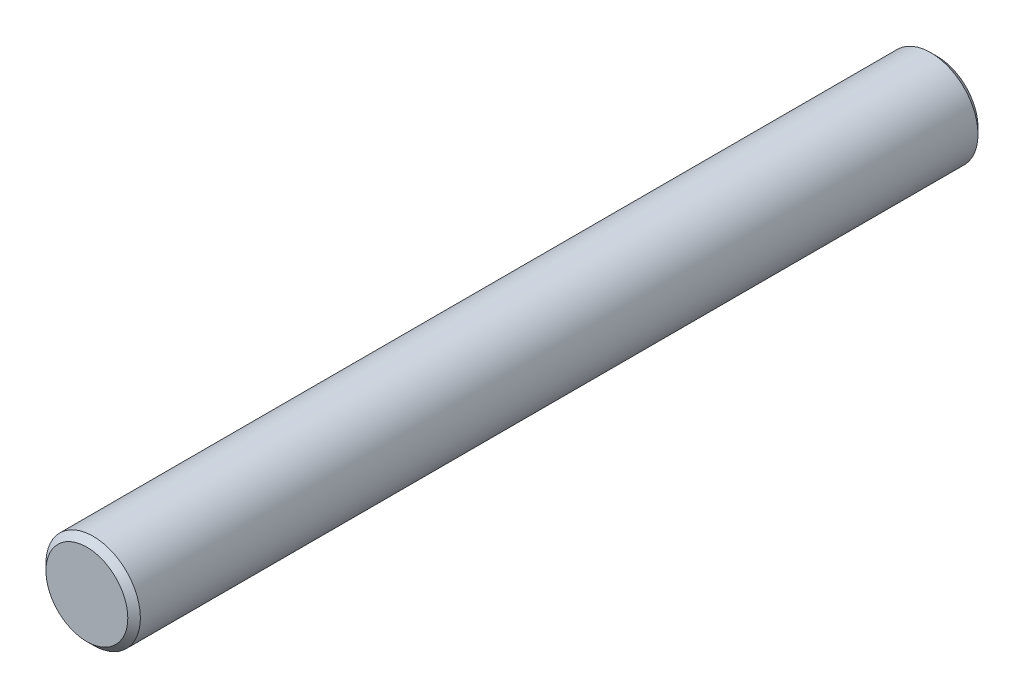
ISO-10303-21;
HEADER;
FILE_DESCRIPTION(('STEP AP214'),'2;1');
FILE_NAME('part.step','',(''),(''),'','','');
FILE_SCHEMA(('AUTOMOTIVE_DESIGN { 1 0 10303 214 1 1 1 1 }'));
ENDSEC;
DATA;
#1=APPLICATION_CONTEXT('core data for automotive mechanical design processes');
#2=APPLICATION_PROTOCOL_DEFINITION('international standard','automotive_design',2000,#1);
#3=PRODUCT_CONTEXT('',#1,'mechanical');
#4=PRODUCT('Part','Part','',(#3));
#5=PRODUCT_RELATED_PRODUCT_CATEGORY('part','',(#4));
#6=PRODUCT_DEFINITION_FORMATION('','',#4);
#7=PRODUCT_DEFINITION_CONTEXT('part definition',#1,'design');
#8=PRODUCT_DEFINITION('design','',#6,#7);
#9=PRODUCT_DEFINITION_SHAPE('','',#8);
#10=(LENGTH_UNIT() NAMED_UNIT(*) SI_UNIT(.MILLI.,.METRE.));
#11=(NAMED_UNIT(*) PLANE_ANGLE_UNIT() SI_UNIT($,.RADIAN.));
#12=(NAMED_UNIT(*) SI_UNIT($,.STERADIAN.) SOLID_ANGLE_UNIT());
#13=UNCERTAINTY_MEASURE_WITH_UNIT(LENGTH_MEASURE(1.E-05),#10,'distance_accuracy_value','');
#14=(GEOMETRIC_REPRESENTATION_CONTEXT(3) GLOBAL_UNCERTAINTY_ASSIGNED_CONTEXT((#13)) GLOBAL_UNIT_ASSIGNED_CONTEXT((#10,
#11,#12)) REPRESENTATION_CONTEXT('',''));
#15=CARTESIAN_POINT('',(0.,0.,0.));
#16=DIRECTION('',(0.,0.,1.));
#17=DIRECTION('',(1.,0.,0.));
#18=AXIS2_PLACEMENT_3D('',#15,#16,#17);
#19=CARTESIAN_POINT('',(0.,0.,27.));
#20=DIRECTION('',(0.,0.,-1.));
#21=DIRECTION('',(-1.,0.,0.));
#22=AXIS2_PLACEMENT_3D('',#19,#20,#21);
#23=CYLINDRICAL_SURFACE('',#22,1.5);
#24=CARTESIAN_POINT('',(0.,0.,0.200000000000003));
#25=DIRECTION('',(0.,0.,1.));
#26=DIRECTION('',(1.,0.,0.));
#27=AXIS2_PLACEMENT_3D('',#24,#25,#26);
#28=CIRCLE('',#27,1.5);
#29=CARTESIAN_POINT('',(1.5,0.,0.200000000000003));
#30=VERTEX_POINT('',#29);
#31=EDGE_CURVE('E27',#30,#30,#28,.T.);
#32=ORIENTED_EDGE('',*,*,#31,.T.);
#33=EDGE_LOOP('',(#32));
#34=FACE_BOUND('',#33,.T.);
#35=CARTESIAN_POINT('',(0.,0.,26.8));
#36=DIRECTION('',(0.,0.,1.));
#37=DIRECTION('',(1.,0.,0.));
#38=AXIS2_PLACEMENT_3D('',#35,#36,#37);
#39=CIRCLE('',#38,1.5);
#40=CARTESIAN_POINT('',(1.5,0.,26.8));
#41=VERTEX_POINT('',#40);
#42=EDGE_CURVE('E28',#41,#41,#39,.F.);
#43=ORIENTED_EDGE('',*,*,#42,.T.);
#44=EDGE_LOOP('',(#43));
#45=FACE_BOUND('',#44,.T.);
#46=ADVANCED_FACE('F15',(#34,#45),#23,.T.);
#47=CARTESIAN_POINT('',(0.,0.,27.));
#48=DIRECTION('',(0.,0.,1.));
#49=DIRECTION('',(1.,0.,0.));
#50=AXIS2_PLACEMENT_3D('',#47,#48,#49);
#51=PLANE('',#50);
#52=CARTESIAN_POINT('',(0.,0.,27.));
#53=DIRECTION('',(0.,0.,1.));
#54=DIRECTION('',(1.,0.,0.));
#55=AXIS2_PLACEMENT_3D('',#52,#53,#54);
#56=CIRCLE('',#55,1.3);
#57=CARTESIAN_POINT('',(1.3,0.,27.));
#58=VERTEX_POINT('',#57);
#59=EDGE_CURVE('E10',#58,#58,#56,.T.);
#60=ORIENTED_EDGE('',*,*,#59,.T.);
#61=EDGE_LOOP('',(#60));
#62=FACE_BOUND('',#61,.T.);
#63=ADVANCED_FACE('F48',(#62),#51,.T.);
#64=CARTESIAN_POINT('',(0.,0.,0.));
#65=DIRECTION('',(0.,0.,1.));
#66=DIRECTION('',(1.,0.,0.));
#67=AXIS2_PLACEMENT_3D('',#64,#65,#66);
#68=PLANE('',#67);
#69=CARTESIAN_POINT('',(0.,0.,0.));
#70=DIRECTION('',(0.,0.,1.));
#71=DIRECTION('',(1.,0.,0.));
#72=AXIS2_PLACEMENT_3D('',#69,#70,#71);
#73=CIRCLE('',#72,1.3);
#74=CARTESIAN_POINT('',(1.3,0.,0.));
#75=VERTEX_POINT('',#74);
#76=EDGE_CURVE('E22',#75,#75,#73,.F.);
#77=ORIENTED_EDGE('',*,*,#76,.T.);
#78=EDGE_LOOP('',(#77));
#79=FACE_BOUND('',#78,.T.);
#80=ADVANCED_FACE('F44',(#79),#68,.F.);
#81=CARTESIAN_POINT('',(0.,0.,0.200000000000003));
#82=DIRECTION('',(0.,0.,1.));
#83=DIRECTION('',(1.,0.,0.));
#84=AXIS2_PLACEMENT_3D('',#81,#82,#83);
#85=CONICAL_SURFACE('',#84,1.5,0.785398163397445);
#86=ORIENTED_EDGE('',*,*,#76,.F.);
#87=EDGE_LOOP('',(#86));
#88=FACE_BOUND('',#87,.T.);
#89=ORIENTED_EDGE('',*,*,#31,.F.);
#90=EDGE_LOOP('',(#89));
#91=FACE_BOUND('',#90,.T.);
#92=ADVANCED_FACE('F39',(#88,#91),#85,.T.);
#93=CARTESIAN_POINT('',(0.,0.,27.));
#94=DIRECTION('',(0.,0.,-1.));
#95=DIRECTION('',(-1.,0.,0.));
#96=AXIS2_PLACEMENT_3D('',#93,#94,#95);
#97=CONICAL_SURFACE('',#96,1.3,0.785398163397446);
#98=ORIENTED_EDGE('',*,*,#42,.F.);
#99=EDGE_LOOP('',(#98));
#100=FACE_BOUND('',#99,.T.);
#101=ORIENTED_EDGE('',*,*,#59,.F.);
#102=EDGE_LOOP('',(#101));
#103=FACE_BOUND('',#102,.T.);
#104=ADVANCED_FACE('F17',(#100,#103),#97,.T.);
#105=CLOSED_SHELL('',(#46,#63,#80,#92,#104));
#106=MANIFOLD_SOLID_BREP('B1',#105);
#107=ADVANCED_BREP_SHAPE_REPRESENTATION('',(#18,#106),#14);
#108=SHAPE_DEFINITION_REPRESENTATION(#9,#107);
ENDSEC;
END-ISO-10303-21;
